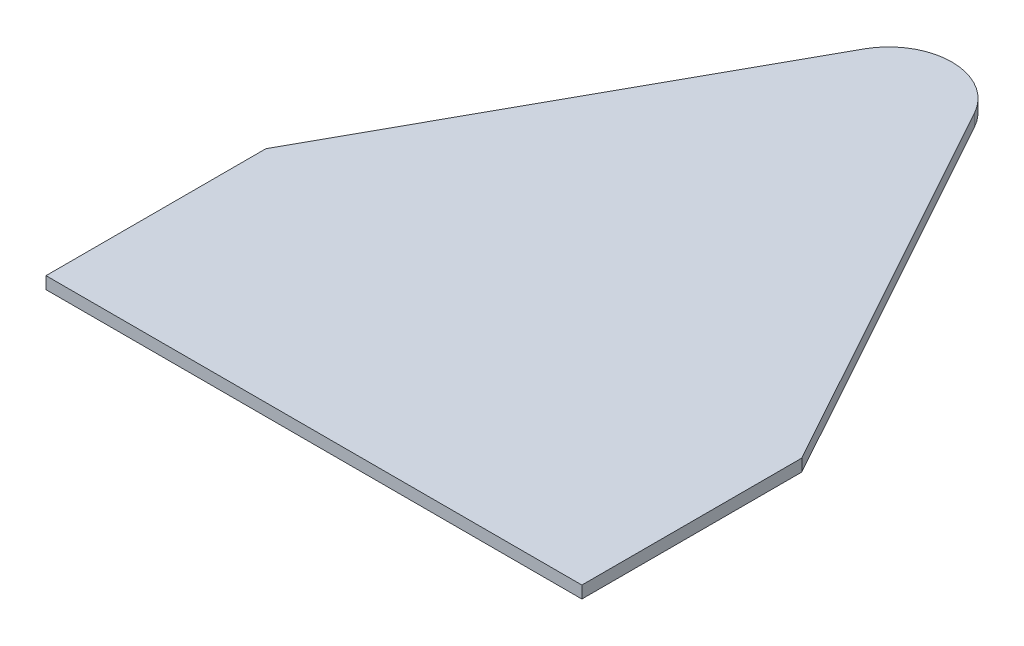
ISO-10303-21;
HEADER;
FILE_DESCRIPTION(('STEP AP214'),'2;1');
FILE_NAME('part.step','',(''),(''),'','','');
FILE_SCHEMA(('AUTOMOTIVE_DESIGN { 1 0 10303 214 1 1 1 1 }'));
ENDSEC;
DATA;
#1=APPLICATION_CONTEXT('core data for automotive mechanical design processes');
#2=APPLICATION_PROTOCOL_DEFINITION('international standard','automotive_design',2000,#1);
#3=PRODUCT_CONTEXT('',#1,'mechanical');
#4=PRODUCT('Part','Part','',(#3));
#5=PRODUCT_RELATED_PRODUCT_CATEGORY('part','',(#4));
#6=PRODUCT_DEFINITION_FORMATION('','',#4);
#7=PRODUCT_DEFINITION_CONTEXT('part definition',#1,'design');
#8=PRODUCT_DEFINITION('design','',#6,#7);
#9=PRODUCT_DEFINITION_SHAPE('','',#8);
#10=(LENGTH_UNIT() NAMED_UNIT(*) SI_UNIT(.MILLI.,.METRE.));
#11=(NAMED_UNIT(*) PLANE_ANGLE_UNIT() SI_UNIT($,.RADIAN.));
#12=(NAMED_UNIT(*) SI_UNIT($,.STERADIAN.) SOLID_ANGLE_UNIT());
#13=UNCERTAINTY_MEASURE_WITH_UNIT(LENGTH_MEASURE(1.E-05),#10,'distance_accuracy_value','');
#14=(GEOMETRIC_REPRESENTATION_CONTEXT(3) GLOBAL_UNCERTAINTY_ASSIGNED_CONTEXT((#13)) GLOBAL_UNIT_ASSIGNED_CONTEXT((#10,
#11,#12)) REPRESENTATION_CONTEXT('',''));
#15=CARTESIAN_POINT('',(0.,0.,0.));
#16=DIRECTION('',(0.,0.,1.));
#17=DIRECTION('',(1.,0.,0.));
#18=AXIS2_PLACEMENT_3D('',#15,#16,#17);
#19=CARTESIAN_POINT('',(0.,2.5,-118.254509979292));
#20=DIRECTION('',(0.,-1.,0.));
#21=DIRECTION('',(0.,0.,-1.));
#22=AXIS2_PLACEMENT_3D('',#19,#20,#21);
#23=CYLINDRICAL_SURFACE('',#22,13.);
#24=CARTESIAN_POINT('',(0.,0.,-118.254509979292));
#25=DIRECTION('',(0.,1.,0.));
#26=DIRECTION('',(0.,0.,1.));
#27=AXIS2_PLACEMENT_3D('',#24,#25,#26);
#28=CIRCLE('',#27,13.);
#29=CARTESIAN_POINT('',(11.385,0.,-124.53));
#30=VERTEX_POINT('',#29);
#31=CARTESIAN_POINT('',(-11.385,0.,-124.53));
#32=VERTEX_POINT('',#31);
#33=EDGE_CURVE('E128',#30,#32,#28,.T.);
#34=ORIENTED_EDGE('',*,*,#33,.T.);
#35=DIRECTION('',(0.,-1.,0.));
#36=VECTOR('',#35,1.);
#37=CARTESIAN_POINT('',(-11.385,2.5,-124.53));
#38=LINE('',#37,#36);
#39=CARTESIAN_POINT('',(-11.385,2.5,-124.53));
#40=VERTEX_POINT('',#39);
#41=EDGE_CURVE('E11',#40,#32,#38,.T.);
#42=ORIENTED_EDGE('',*,*,#41,.F.);
#43=CARTESIAN_POINT('',(0.,2.5,-118.254509979292));
#44=DIRECTION('',(0.,1.,0.));
#45=DIRECTION('',(0.,0.,1.));
#46=AXIS2_PLACEMENT_3D('',#43,#44,#45);
#47=CIRCLE('',#46,13.);
#48=CARTESIAN_POINT('',(11.385,2.5,-124.53));
#49=VERTEX_POINT('',#48);
#50=EDGE_CURVE('E144',#49,#40,#47,.T.);
#51=ORIENTED_EDGE('',*,*,#50,.F.);
#52=DIRECTION('',(0.,-1.,0.));
#53=VECTOR('',#52,1.);
#54=CARTESIAN_POINT('',(11.385,2.5,-124.53));
#55=LINE('',#54,#53);
#56=EDGE_CURVE('E124',#49,#30,#55,.T.);
#57=ORIENTED_EDGE('',*,*,#56,.T.);
#58=EDGE_LOOP('',(#34,#42,#51,#57));
#59=FACE_BOUND('',#58,.T.);
#60=ADVANCED_FACE('F39',(#59),#23,.T.);
#61=CARTESIAN_POINT('',(-11.385,2.5,-124.53));
#62=DIRECTION('',(0.875580905639776,0.,0.483071503691773));
#63=DIRECTION('',(0.483071503691773,0.,-0.875580905639776));
#64=AXIS2_PLACEMENT_3D('',#61,#62,#63);
#65=PLANE('',#64);
#66=DIRECTION('',(-0.483071503691773,0.,0.875580905639776));
#67=VECTOR('',#66,1.);
#68=CARTESIAN_POINT('',(-11.385,0.,-124.53));
#69=LINE('',#68,#67);
#70=CARTESIAN_POINT('',(-55.125,0.,-45.25));
#71=VERTEX_POINT('',#70);
#72=EDGE_CURVE('E132',#32,#71,#69,.T.);
#73=ORIENTED_EDGE('',*,*,#72,.T.);
#74=DIRECTION('',(0.,-1.,0.));
#75=VECTOR('',#74,1.);
#76=CARTESIAN_POINT('',(-55.125,2.5,-45.25));
#77=LINE('',#76,#75);
#78=CARTESIAN_POINT('',(-55.125,2.5,-45.25));
#79=VERTEX_POINT('',#78);
#80=EDGE_CURVE('E48',#79,#71,#77,.T.);
#81=ORIENTED_EDGE('',*,*,#80,.F.);
#82=DIRECTION('',(-0.483071503691773,0.,0.875580905639776));
#83=VECTOR('',#82,1.);
#84=CARTESIAN_POINT('',(-11.385,2.5,-124.53));
#85=LINE('',#84,#83);
#86=EDGE_CURVE('E93',#40,#79,#85,.T.);
#87=ORIENTED_EDGE('',*,*,#86,.F.);
#88=ORIENTED_EDGE('',*,*,#41,.T.);
#89=EDGE_LOOP('',(#73,#81,#87,#88));
#90=FACE_BOUND('',#89,.T.);
#91=ADVANCED_FACE('F172',(#90),#65,.F.);
#92=CARTESIAN_POINT('',(-55.125,2.5,-45.25));
#93=DIRECTION('',(1.,0.,0.));
#94=DIRECTION('',(0.,0.,-1.));
#95=AXIS2_PLACEMENT_3D('',#92,#93,#94);
#96=PLANE('',#95);
#97=DIRECTION('',(0.,0.,1.));
#98=VECTOR('',#97,1.);
#99=CARTESIAN_POINT('',(-55.125,0.,-45.25));
#100=LINE('',#99,#98);
#101=CARTESIAN_POINT('',(-55.125,0.,0.));
#102=VERTEX_POINT('',#101);
#103=EDGE_CURVE('E135',#71,#102,#100,.T.);
#104=ORIENTED_EDGE('',*,*,#103,.T.);
#105=DIRECTION('',(0.,-1.,0.));
#106=VECTOR('',#105,1.);
#107=CARTESIAN_POINT('',(-55.125,2.5,0.));
#108=LINE('',#107,#106);
#109=CARTESIAN_POINT('',(-55.125,2.5,0.));
#110=VERTEX_POINT('',#109);
#111=EDGE_CURVE('E117',#110,#102,#108,.T.);
#112=ORIENTED_EDGE('',*,*,#111,.F.);
#113=DIRECTION('',(0.,0.,1.));
#114=VECTOR('',#113,1.);
#115=CARTESIAN_POINT('',(-55.125,2.5,-45.25));
#116=LINE('',#115,#114);
#117=EDGE_CURVE('E106',#79,#110,#116,.T.);
#118=ORIENTED_EDGE('',*,*,#117,.F.);
#119=ORIENTED_EDGE('',*,*,#80,.T.);
#120=EDGE_LOOP('',(#104,#112,#118,#119));
#121=FACE_BOUND('',#120,.T.);
#122=ADVANCED_FACE('F154',(#121),#96,.F.);
#123=CARTESIAN_POINT('',(-55.125,2.5,0.));
#124=DIRECTION('',(0.,0.,-1.));
#125=DIRECTION('',(-1.,0.,0.));
#126=AXIS2_PLACEMENT_3D('',#123,#124,#125);
#127=PLANE('',#126);
#128=DIRECTION('',(1.,0.,0.));
#129=VECTOR('',#128,1.);
#130=CARTESIAN_POINT('',(-55.125,0.,0.));
#131=LINE('',#130,#129);
#132=CARTESIAN_POINT('',(55.125,0.,0.));
#133=VERTEX_POINT('',#132);
#134=EDGE_CURVE('E115',#102,#133,#131,.T.);
#135=ORIENTED_EDGE('',*,*,#134,.T.);
#136=DIRECTION('',(0.,-1.,0.));
#137=VECTOR('',#136,1.);
#138=CARTESIAN_POINT('',(55.125,2.5,0.));
#139=LINE('',#138,#137);
#140=CARTESIAN_POINT('',(55.125,2.5,0.));
#141=VERTEX_POINT('',#140);
#142=EDGE_CURVE('E112',#141,#133,#139,.T.);
#143=ORIENTED_EDGE('',*,*,#142,.F.);
#144=DIRECTION('',(1.,0.,0.));
#145=VECTOR('',#144,1.);
#146=CARTESIAN_POINT('',(-55.125,2.5,0.));
#147=LINE('',#146,#145);
#148=EDGE_CURVE('E100',#110,#141,#147,.T.);
#149=ORIENTED_EDGE('',*,*,#148,.F.);
#150=ORIENTED_EDGE('',*,*,#111,.T.);
#151=EDGE_LOOP('',(#135,#143,#149,#150));
#152=FACE_BOUND('',#151,.T.);
#153=ADVANCED_FACE('F113',(#152),#127,.F.);
#154=CARTESIAN_POINT('',(55.125,2.5,0.));
#155=DIRECTION('',(-1.,0.,0.));
#156=DIRECTION('',(0.,0.,1.));
#157=AXIS2_PLACEMENT_3D('',#154,#155,#156);
#158=PLANE('',#157);
#159=DIRECTION('',(0.,0.,-1.));
#160=VECTOR('',#159,1.);
#161=CARTESIAN_POINT('',(55.125,0.,0.));
#162=LINE('',#161,#160);
#163=CARTESIAN_POINT('',(55.125,0.,-45.25));
#164=VERTEX_POINT('',#163);
#165=EDGE_CURVE('E79',#133,#164,#162,.T.);
#166=ORIENTED_EDGE('',*,*,#165,.T.);
#167=DIRECTION('',(0.,-1.,0.));
#168=VECTOR('',#167,1.);
#169=CARTESIAN_POINT('',(55.125,2.5,-45.25));
#170=LINE('',#169,#168);
#171=CARTESIAN_POINT('',(55.125,2.5,-45.25));
#172=VERTEX_POINT('',#171);
#173=EDGE_CURVE('E118',#172,#164,#170,.T.);
#174=ORIENTED_EDGE('',*,*,#173,.F.);
#175=DIRECTION('',(0.,0.,-1.));
#176=VECTOR('',#175,1.);
#177=CARTESIAN_POINT('',(55.125,2.5,0.));
#178=LINE('',#177,#176);
#179=EDGE_CURVE('E104',#141,#172,#178,.T.);
#180=ORIENTED_EDGE('',*,*,#179,.F.);
#181=ORIENTED_EDGE('',*,*,#142,.T.);
#182=EDGE_LOOP('',(#166,#174,#180,#181));
#183=FACE_BOUND('',#182,.T.);
#184=ADVANCED_FACE('F120',(#183),#158,.F.);
#185=CARTESIAN_POINT('',(55.125,2.5,-45.25));
#186=DIRECTION('',(-0.875580905639775,0.,0.483071503691773));
#187=DIRECTION('',(0.483071503691773,0.,0.875580905639775));
#188=AXIS2_PLACEMENT_3D('',#185,#186,#187);
#189=PLANE('',#188);
#190=DIRECTION('',(-0.483071503691773,0.,-0.875580905639775));
#191=VECTOR('',#190,1.);
#192=CARTESIAN_POINT('',(55.125,0.,-45.25));
#193=LINE('',#192,#191);
#194=EDGE_CURVE('E85',#164,#30,#193,.T.);
#195=ORIENTED_EDGE('',*,*,#194,.T.);
#196=ORIENTED_EDGE('',*,*,#56,.F.);
#197=DIRECTION('',(-0.483071503691773,0.,-0.875580905639775));
#198=VECTOR('',#197,1.);
#199=CARTESIAN_POINT('',(55.125,2.5,-45.25));
#200=LINE('',#199,#198);
#201=EDGE_CURVE('E56',#172,#49,#200,.T.);
#202=ORIENTED_EDGE('',*,*,#201,.F.);
#203=ORIENTED_EDGE('',*,*,#173,.T.);
#204=EDGE_LOOP('',(#195,#196,#202,#203));
#205=FACE_BOUND('',#204,.T.);
#206=ADVANCED_FACE('F161',(#205),#189,.F.);
#207=CARTESIAN_POINT('',(0.,2.5,-118.254509979292));
#208=DIRECTION('',(0.,1.,0.));
#209=DIRECTION('',(0.,0.,1.));
#210=AXIS2_PLACEMENT_3D('',#207,#208,#209);
#211=PLANE('',#210);
#212=ORIENTED_EDGE('',*,*,#50,.T.);
#213=ORIENTED_EDGE('',*,*,#86,.T.);
#214=ORIENTED_EDGE('',*,*,#117,.T.);
#215=ORIENTED_EDGE('',*,*,#148,.T.);
#216=ORIENTED_EDGE('',*,*,#179,.T.);
#217=ORIENTED_EDGE('',*,*,#201,.T.);
#218=EDGE_LOOP('',(#212,#213,#214,#215,#216,#217));
#219=FACE_BOUND('',#218,.T.);
#220=ADVANCED_FACE('F102',(#219),#211,.T.);
#221=CARTESIAN_POINT('',(0.,0.,-118.254509979292));
#222=DIRECTION('',(0.,1.,0.));
#223=DIRECTION('',(0.,0.,1.));
#224=AXIS2_PLACEMENT_3D('',#221,#222,#223);
#225=PLANE('',#224);
#226=ORIENTED_EDGE('',*,*,#33,.F.);
#227=ORIENTED_EDGE('',*,*,#194,.F.);
#228=ORIENTED_EDGE('',*,*,#165,.F.);
#229=ORIENTED_EDGE('',*,*,#134,.F.);
#230=ORIENTED_EDGE('',*,*,#103,.F.);
#231=ORIENTED_EDGE('',*,*,#72,.F.);
#232=EDGE_LOOP('',(#226,#227,#228,#229,#230,#231));
#233=FACE_BOUND('',#232,.T.);
#234=ADVANCED_FACE('F157',(#233),#225,.F.);
#235=CLOSED_SHELL('',(#60,#91,#122,#153,#184,#206,#220,#234));
#236=MANIFOLD_SOLID_BREP('B2',#235);
#237=ADVANCED_BREP_SHAPE_REPRESENTATION('',(#18,#236),#14);
#238=SHAPE_DEFINITION_REPRESENTATION(#9,#237);
ENDSEC;
END-ISO-10303-21;
